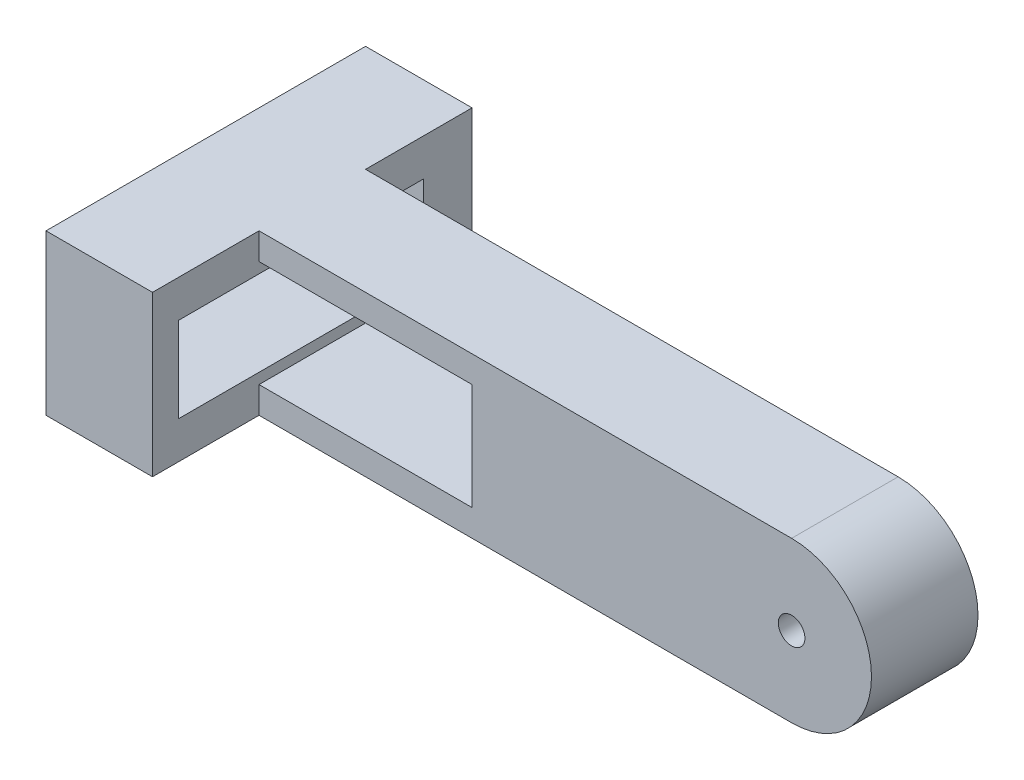
ISO-10303-21;
HEADER;
FILE_DESCRIPTION(('STEP AP214'),'2;1');
FILE_NAME('part.step','',(''),(''),'','','');
FILE_SCHEMA(('AUTOMOTIVE_DESIGN { 1 0 10303 214 1 1 1 1 }'));
ENDSEC;
DATA;
#1=APPLICATION_CONTEXT('core data for automotive mechanical design processes');
#2=APPLICATION_PROTOCOL_DEFINITION('international standard','automotive_design',2000,#1);
#3=PRODUCT_CONTEXT('',#1,'mechanical');
#4=PRODUCT('Part','Part','',(#3));
#5=PRODUCT_RELATED_PRODUCT_CATEGORY('part','',(#4));
#6=PRODUCT_DEFINITION_FORMATION('','',#4);
#7=PRODUCT_DEFINITION_CONTEXT('part definition',#1,'design');
#8=PRODUCT_DEFINITION('design','',#6,#7);
#9=PRODUCT_DEFINITION_SHAPE('','',#8);
#10=(LENGTH_UNIT() NAMED_UNIT(*) SI_UNIT(.MILLI.,.METRE.));
#11=(NAMED_UNIT(*) PLANE_ANGLE_UNIT() SI_UNIT($,.RADIAN.));
#12=(NAMED_UNIT(*) SI_UNIT($,.STERADIAN.) SOLID_ANGLE_UNIT());
#13=UNCERTAINTY_MEASURE_WITH_UNIT(LENGTH_MEASURE(1.E-05),#10,'distance_accuracy_value','');
#14=(GEOMETRIC_REPRESENTATION_CONTEXT(3) GLOBAL_UNCERTAINTY_ASSIGNED_CONTEXT((#13)) GLOBAL_UNIT_ASSIGNED_CONTEXT((#10,
#11,#12)) REPRESENTATION_CONTEXT('',''));
#15=CARTESIAN_POINT('',(0.,0.,0.));
#16=DIRECTION('',(0.,0.,1.));
#17=DIRECTION('',(1.,0.,0.));
#18=AXIS2_PLACEMENT_3D('',#15,#16,#17);
#19=CARTESIAN_POINT('',(-121.636901302796,-10.16,35.720147));
#20=DIRECTION('',(0.,0.,1.));
#21=DIRECTION('',(1.,0.,0.));
#22=AXIS2_PLACEMENT_3D('',#19,#20,#21);
#23=PLANE('',#22);
#24=DIRECTION('',(0.,-1.,0.));
#25=VECTOR('',#24,1.);
#26=CARTESIAN_POINT('',(-74.200004,-10.16,35.720147));
#27=LINE('',#26,#25);
#28=CARTESIAN_POINT('',(-74.200004,-1.27,35.720147));
#29=VERTEX_POINT('',#28);
#30=CARTESIAN_POINT('',(-74.200004,-10.16,35.720147));
#31=VERTEX_POINT('',#30);
#32=EDGE_CURVE('E263',#29,#31,#27,.T.);
#33=ORIENTED_EDGE('',*,*,#32,.F.);
#34=DIRECTION('',(1.,0.,0.));
#35=VECTOR('',#34,1.);
#36=CARTESIAN_POINT('',(-83.4457435593863,-1.27,35.720147));
#37=LINE('',#36,#35);
#38=CARTESIAN_POINT('',(-65.600072,-1.27,35.720147));
#39=VERTEX_POINT('',#38);
#40=EDGE_CURVE('E245',#29,#39,#37,.T.);
#41=ORIENTED_EDGE('',*,*,#40,.T.);
#42=DIRECTION('',(0.,1.,0.));
#43=VECTOR('',#42,1.);
#44=CARTESIAN_POINT('',(-65.600072,10.16,35.720147));
#45=LINE('',#44,#43);
#46=CARTESIAN_POINT('',(-65.600072,-10.16,35.720147));
#47=VERTEX_POINT('',#46);
#48=EDGE_CURVE('E487',#47,#39,#45,.T.);
#49=ORIENTED_EDGE('',*,*,#48,.F.);
#50=DIRECTION('',(1.,0.,0.));
#51=VECTOR('',#50,1.);
#52=CARTESIAN_POINT('',(-121.636901302796,-10.16,35.720147));
#53=LINE('',#52,#51);
#54=EDGE_CURVE('E271',#31,#47,#53,.T.);
#55=ORIENTED_EDGE('',*,*,#54,.F.);
#56=EDGE_LOOP('',(#33,#41,#49,#55));
#57=FACE_BOUND('',#56,.T.);
#58=ADVANCED_FACE('F58',(#57),#23,.F.);
#59=CARTESIAN_POINT('',(-121.636901302796,-10.16,-4.91985299999999));
#60=DIRECTION('',(0.,0.,-1.));
#61=DIRECTION('',(-1.,0.,0.));
#62=AXIS2_PLACEMENT_3D('',#59,#60,#61);
#63=PLANE('',#62);
#64=DIRECTION('',(0.,-1.,0.));
#65=VECTOR('',#64,1.);
#66=CARTESIAN_POINT('',(-65.600072,10.16,-4.91985299999999));
#67=LINE('',#66,#65);
#68=CARTESIAN_POINT('',(-65.600072,-1.27000000000001,-4.919853));
#69=VERTEX_POINT('',#68);
#70=CARTESIAN_POINT('',(-65.600072,-10.16,-4.91985299999999));
#71=VERTEX_POINT('',#70);
#72=EDGE_CURVE('E522',#69,#71,#67,.T.);
#73=ORIENTED_EDGE('',*,*,#72,.F.);
#74=DIRECTION('',(1.,0.,0.));
#75=VECTOR('',#74,1.);
#76=CARTESIAN_POINT('',(-83.4457435593863,-1.27000000000001,-4.919853));
#77=LINE('',#76,#75);
#78=CARTESIAN_POINT('',(-74.200004,-1.27000000000001,-4.919853));
#79=VERTEX_POINT('',#78);
#80=EDGE_CURVE('E589',#79,#69,#77,.T.);
#81=ORIENTED_EDGE('',*,*,#80,.F.);
#82=DIRECTION('',(0.,1.,0.));
#83=VECTOR('',#82,1.);
#84=CARTESIAN_POINT('',(-74.200004,-10.16,-4.91985299999999));
#85=LINE('',#84,#83);
#86=CARTESIAN_POINT('',(-74.200004,-10.16,-4.91985299999999));
#87=VERTEX_POINT('',#86);
#88=EDGE_CURVE('E291',#87,#79,#85,.T.);
#89=ORIENTED_EDGE('',*,*,#88,.F.);
#90=DIRECTION('',(1.,0.,0.));
#91=VECTOR('',#90,1.);
#92=CARTESIAN_POINT('',(-121.636901302796,-10.16,-4.91985299999999));
#93=LINE('',#92,#91);
#94=EDGE_CURVE('E283',#87,#71,#93,.T.);
#95=ORIENTED_EDGE('',*,*,#94,.T.);
#96=EDGE_LOOP('',(#73,#81,#89,#95));
#97=FACE_BOUND('',#96,.T.);
#98=ADVANCED_FACE('F456',(#97),#63,.F.);
#99=CARTESIAN_POINT('',(-65.600072,-19.0500000000001,25.4));
#100=DIRECTION('',(-1.,0.,0.));
#101=DIRECTION('',(0.,0.,1.));
#102=AXIS2_PLACEMENT_3D('',#99,#100,#101);
#103=PLANE('',#102);
#104=CARTESIAN_POINT('',(-65.600072,-4.99999,-9.099804));
#105=DIRECTION('',(-1.,0.,0.));
#106=DIRECTION('',(0.,0.,1.));
#107=AXIS2_PLACEMENT_3D('',#104,#105,#106);
#108=CIRCLE('',#107,1.90500000000001);
#109=CARTESIAN_POINT('',(-65.600072,-4.99999,-7.19480399999999));
#110=VERTEX_POINT('',#109);
#111=EDGE_CURVE('E490',#110,#110,#108,.F.);
#112=ORIENTED_EDGE('',*,*,#111,.F.);
#113=EDGE_LOOP('',(#112));
#114=FACE_BOUND('',#113,.T.);
#115=DIRECTION('',(0.,1.,0.));
#116=VECTOR('',#115,1.);
#117=CARTESIAN_POINT('',(-65.600072,10.16,-13.809853));
#118=LINE('',#117,#116);
#119=CARTESIAN_POINT('',(-65.600072,-10.16,-13.809853));
#120=VERTEX_POINT('',#119);
#121=CARTESIAN_POINT('',(-65.600072,-1.27000000000002,-13.809853));
#122=VERTEX_POINT('',#121);
#123=EDGE_CURVE('E510',#120,#122,#118,.T.);
#124=ORIENTED_EDGE('',*,*,#123,.T.);
#125=DIRECTION('',(0.,0.,-1.));
#126=VECTOR('',#125,1.);
#127=CARTESIAN_POINT('',(-65.600072,-1.27000000000001,-4.919853));
#128=LINE('',#127,#126);
#129=EDGE_CURVE('E75',#69,#122,#128,.T.);
#130=ORIENTED_EDGE('',*,*,#129,.F.);
#131=ORIENTED_EDGE('',*,*,#72,.T.);
#132=DIRECTION('',(0.,0.,-1.));
#133=VECTOR('',#132,1.);
#134=CARTESIAN_POINT('',(-65.600072,-10.16,-4.91985299999999));
#135=LINE('',#134,#133);
#136=EDGE_CURVE('E509',#71,#120,#135,.T.);
#137=ORIENTED_EDGE('',*,*,#136,.T.);
#138=EDGE_LOOP('',(#124,#130,#131,#137));
#139=FACE_BOUND('',#138,.T.);
#140=ADVANCED_FACE('F463',(#114,#139),#103,.F.);
#141=CARTESIAN_POINT('',(-65.600072,-19.0500000000001,25.4));
#142=DIRECTION('',(-1.,0.,0.));
#143=DIRECTION('',(0.,0.,1.));
#144=AXIS2_PLACEMENT_3D('',#141,#142,#143);
#145=PLANE('',#144);
#146=CARTESIAN_POINT('',(-65.600072,-4.99999,39.900098));
#147=DIRECTION('',(-1.,0.,0.));
#148=DIRECTION('',(0.,0.,1.));
#149=AXIS2_PLACEMENT_3D('',#146,#147,#148);
#150=CIRCLE('',#149,1.90500000000001);
#151=CARTESIAN_POINT('',(-65.600072,-4.99999,41.805098));
#152=VERTEX_POINT('',#151);
#153=EDGE_CURVE('E534',#152,#152,#150,.F.);
#154=ORIENTED_EDGE('',*,*,#153,.F.);
#155=EDGE_LOOP('',(#154));
#156=FACE_BOUND('',#155,.T.);
#157=ORIENTED_EDGE('',*,*,#48,.T.);
#158=DIRECTION('',(0.,0.,-1.));
#159=VECTOR('',#158,1.);
#160=CARTESIAN_POINT('',(-65.600072,-1.27,35.720147));
#161=LINE('',#160,#159);
#162=CARTESIAN_POINT('',(-65.600072,-1.27,44.610147));
#163=VERTEX_POINT('',#162);
#164=EDGE_CURVE('E251',#163,#39,#161,.T.);
#165=ORIENTED_EDGE('',*,*,#164,.F.);
#166=DIRECTION('',(0.,-1.,0.));
#167=VECTOR('',#166,1.);
#168=CARTESIAN_POINT('',(-65.600072,10.16,44.610147));
#169=LINE('',#168,#167);
#170=CARTESIAN_POINT('',(-65.600072,-10.16,44.610147));
#171=VERTEX_POINT('',#170);
#172=EDGE_CURVE('E500',#163,#171,#169,.T.);
#173=ORIENTED_EDGE('',*,*,#172,.T.);
#174=DIRECTION('',(0.,0.,-1.));
#175=VECTOR('',#174,1.);
#176=CARTESIAN_POINT('',(-65.600072,-10.16,35.720147));
#177=LINE('',#176,#175);
#178=EDGE_CURVE('E488',#171,#47,#177,.T.);
#179=ORIENTED_EDGE('',*,*,#178,.T.);
#180=EDGE_LOOP('',(#157,#165,#173,#179));
#181=FACE_BOUND('',#180,.T.);
#182=ADVANCED_FACE('F622',(#156,#181),#145,.F.);
#183=CARTESIAN_POINT('',(0.,0.,0.));
#184=DIRECTION('',(0.,0.,1.));
#185=DIRECTION('',(1.,0.,0.));
#186=AXIS2_PLACEMENT_3D('',#183,#184,#185);
#187=PLANE('',#186);
#188=CARTESIAN_POINT('',(76.2,0.,0.));
#189=DIRECTION('',(0.,0.,1.));
#190=DIRECTION('',(1.,0.,0.));
#191=AXIS2_PLACEMENT_3D('',#188,#189,#190);
#192=CIRCLE('',#191,3.175);
#193=CARTESIAN_POINT('',(79.375,0.,0.));
#194=VERTEX_POINT('',#193);
#195=EDGE_CURVE('E593',#194,#194,#192,.T.);
#196=ORIENTED_EDGE('',*,*,#195,.T.);
#197=EDGE_LOOP('',(#196));
#198=FACE_BOUND('',#197,.T.);
#199=DIRECTION('',(0.,-1.,0.));
#200=VECTOR('',#199,1.);
#201=CARTESIAN_POINT('',(0.,-12.7,0.));
#202=LINE('',#201,#200);
#203=CARTESIAN_POINT('',(0.,12.7,0.));
#204=VERTEX_POINT('',#203);
#205=CARTESIAN_POINT('',(0.,-12.7,0.));
#206=VERTEX_POINT('',#205);
#207=EDGE_CURVE('E292',#204,#206,#202,.T.);
#208=ORIENTED_EDGE('',*,*,#207,.F.);
#209=DIRECTION('',(1.,0.,0.));
#210=VECTOR('',#209,1.);
#211=CARTESIAN_POINT('',(0.,12.7,0.));
#212=LINE('',#211,#210);
#213=CARTESIAN_POINT('',(-50.8,12.7,0.));
#214=VERTEX_POINT('',#213);
#215=EDGE_CURVE('E294',#214,#204,#212,.T.);
#216=ORIENTED_EDGE('',*,*,#215,.F.);
#217=DIRECTION('',(0.,-1.,0.));
#218=VECTOR('',#217,1.);
#219=CARTESIAN_POINT('',(-50.8,19.05,0.));
#220=LINE('',#219,#218);
#221=CARTESIAN_POINT('',(-50.8,19.05,0.));
#222=VERTEX_POINT('',#221);
#223=EDGE_CURVE('E336',#222,#214,#220,.T.);
#224=ORIENTED_EDGE('',*,*,#223,.F.);
#225=DIRECTION('',(1.,0.,0.));
#226=VECTOR('',#225,1.);
#227=CARTESIAN_POINT('',(-76.2,19.05,0.));
#228=LINE('',#227,#226);
#229=CARTESIAN_POINT('',(76.2,19.05,0.));
#230=VERTEX_POINT('',#229);
#231=EDGE_CURVE('E379',#222,#230,#228,.T.);
#232=ORIENTED_EDGE('',*,*,#231,.T.);
#233=CARTESIAN_POINT('',(76.2,0.,0.));
#234=DIRECTION('',(0.,0.,1.));
#235=DIRECTION('',(1.,0.,0.));
#236=AXIS2_PLACEMENT_3D('',#233,#234,#235);
#237=CIRCLE('',#236,19.05);
#238=CARTESIAN_POINT('',(76.2,-19.05,0.));
#239=VERTEX_POINT('',#238);
#240=EDGE_CURVE('E372',#239,#230,#237,.T.);
#241=ORIENTED_EDGE('',*,*,#240,.F.);
#242=DIRECTION('',(1.,0.,0.));
#243=VECTOR('',#242,1.);
#244=CARTESIAN_POINT('',(-76.2,-19.0500000000001,0.));
#245=LINE('',#244,#243);
#246=CARTESIAN_POINT('',(-50.8,-19.0500000000001,0.));
#247=VERTEX_POINT('',#246);
#248=EDGE_CURVE('E376',#247,#239,#245,.T.);
#249=ORIENTED_EDGE('',*,*,#248,.F.);
#250=CARTESIAN_POINT('',(-50.8,-12.7,0.));
#251=VERTEX_POINT('',#250);
#252=EDGE_CURVE('E331',#251,#247,#220,.T.);
#253=ORIENTED_EDGE('',*,*,#252,.F.);
#254=DIRECTION('',(-1.,0.,0.));
#255=VECTOR('',#254,1.);
#256=CARTESIAN_POINT('',(0.,-12.7,0.));
#257=LINE('',#256,#255);
#258=EDGE_CURVE('E297',#206,#251,#257,.T.);
#259=ORIENTED_EDGE('',*,*,#258,.F.);
#260=EDGE_LOOP('',(#208,#216,#224,#232,#241,#249,#253,#259));
#261=FACE_BOUND('',#260,.T.);
#262=ADVANCED_FACE('F399',(#198,#261),#187,.F.);
#263=CARTESIAN_POINT('',(-76.2,19.05,25.4));
#264=DIRECTION('',(0.,1.,0.));
#265=DIRECTION('',(-1.,0.,0.));
#266=AXIS2_PLACEMENT_3D('',#263,#264,#265);
#267=PLANE('',#266);
#268=ORIENTED_EDGE('',*,*,#231,.F.);
#269=DIRECTION('',(0.,0.,1.));
#270=VECTOR('',#269,1.);
#271=CARTESIAN_POINT('',(-50.8,19.05,-25.4));
#272=LINE('',#271,#270);
#273=CARTESIAN_POINT('',(-50.8,19.05,-25.4));
#274=VERTEX_POINT('',#273);
#275=EDGE_CURVE('E349',#274,#222,#272,.T.);
#276=ORIENTED_EDGE('',*,*,#275,.F.);
#277=DIRECTION('',(1.,0.,0.));
#278=VECTOR('',#277,1.);
#279=CARTESIAN_POINT('',(-76.2,19.05,-25.4));
#280=LINE('',#279,#278);
#281=CARTESIAN_POINT('',(-76.2,19.05,-25.4));
#282=VERTEX_POINT('',#281);
#283=EDGE_CURVE('E332',#282,#274,#280,.T.);
#284=ORIENTED_EDGE('',*,*,#283,.F.);
#285=DIRECTION('',(0.,0.,-1.));
#286=VECTOR('',#285,1.);
#287=CARTESIAN_POINT('',(-76.2,19.05,25.4));
#288=LINE('',#287,#286);
#289=CARTESIAN_POINT('',(-76.2,19.05,50.8));
#290=VERTEX_POINT('',#289);
#291=EDGE_CURVE('E13',#290,#282,#288,.T.);
#292=ORIENTED_EDGE('',*,*,#291,.F.);
#293=DIRECTION('',(-1.,0.,0.));
#294=VECTOR('',#293,1.);
#295=CARTESIAN_POINT('',(-76.2,19.05,50.8));
#296=LINE('',#295,#294);
#297=CARTESIAN_POINT('',(-50.8,19.05,50.8));
#298=VERTEX_POINT('',#297);
#299=EDGE_CURVE('E361',#298,#290,#296,.T.);
#300=ORIENTED_EDGE('',*,*,#299,.F.);
#301=DIRECTION('',(0.,0.,-1.));
#302=VECTOR('',#301,1.);
#303=CARTESIAN_POINT('',(-50.8,19.05,50.8));
#304=LINE('',#303,#302);
#305=CARTESIAN_POINT('',(-50.8,19.05,25.4));
#306=VERTEX_POINT('',#305);
#307=EDGE_CURVE('E364',#298,#306,#304,.T.);
#308=ORIENTED_EDGE('',*,*,#307,.T.);
#309=DIRECTION('',(1.,0.,0.));
#310=VECTOR('',#309,1.);
#311=CARTESIAN_POINT('',(-76.2,19.05,25.4));
#312=LINE('',#311,#310);
#313=CARTESIAN_POINT('',(76.2,19.05,25.4));
#314=VERTEX_POINT('',#313);
#315=EDGE_CURVE('E373',#306,#314,#312,.T.);
#316=ORIENTED_EDGE('',*,*,#315,.T.);
#317=DIRECTION('',(0.,0.,-1.));
#318=VECTOR('',#317,1.);
#319=CARTESIAN_POINT('',(76.2,19.05,25.4));
#320=LINE('',#319,#318);
#321=EDGE_CURVE('E378',#314,#230,#320,.T.);
#322=ORIENTED_EDGE('',*,*,#321,.T.);
#323=EDGE_LOOP('',(#268,#276,#284,#292,#300,#308,#316,#322));
#324=FACE_BOUND('',#323,.T.);
#325=ADVANCED_FACE('F405',(#324),#267,.T.);
#326=CARTESIAN_POINT('',(-76.2,-19.0500000000001,25.4));
#327=DIRECTION('',(-1.,0.,0.));
#328=DIRECTION('',(0.,0.,1.));
#329=AXIS2_PLACEMENT_3D('',#326,#327,#328);
#330=PLANE('',#329);
#331=CARTESIAN_POINT('',(-76.2,-4.99999,39.900098));
#332=DIRECTION('',(-1.,0.,0.));
#333=DIRECTION('',(0.,0.,-1.));
#334=AXIS2_PLACEMENT_3D('',#331,#332,#333);
#335=CIRCLE('',#334,1.90500000000001);
#336=CARTESIAN_POINT('',(-76.2,-4.99999,37.995098));
#337=VERTEX_POINT('',#336);
#338=EDGE_CURVE('E316',#337,#337,#335,.T.);
#339=ORIENTED_EDGE('',*,*,#338,.F.);
#340=EDGE_LOOP('',(#339));
#341=FACE_BOUND('',#340,.T.);
#342=CARTESIAN_POINT('',(-76.2,-4.99999,-9.099804));
#343=DIRECTION('',(-1.,0.,0.));
#344=DIRECTION('',(0.,0.,-1.));
#345=AXIS2_PLACEMENT_3D('',#342,#343,#344);
#346=CIRCLE('',#345,1.90500000000001);
#347=CARTESIAN_POINT('',(-76.2,-4.99999,-11.004804));
#348=VERTEX_POINT('',#347);
#349=EDGE_CURVE('E324',#348,#348,#346,.T.);
#350=ORIENTED_EDGE('',*,*,#349,.F.);
#351=EDGE_LOOP('',(#350));
#352=FACE_BOUND('',#351,.T.);
#353=CARTESIAN_POINT('',(-76.2,4.99999,-9.099804));
#354=DIRECTION('',(-1.,0.,0.));
#355=DIRECTION('',(0.,0.,1.));
#356=AXIS2_PLACEMENT_3D('',#353,#354,#355);
#357=CIRCLE('',#356,1.90500000000001);
#358=CARTESIAN_POINT('',(-76.2,4.99999,-7.19480399999999));
#359=VERTEX_POINT('',#358);
#360=EDGE_CURVE('E321',#359,#359,#357,.T.);
#361=ORIENTED_EDGE('',*,*,#360,.F.);
#362=EDGE_LOOP('',(#361));
#363=FACE_BOUND('',#362,.T.);
#364=CARTESIAN_POINT('',(-76.2,4.99999,39.900098));
#365=DIRECTION('',(-1.,0.,0.));
#366=DIRECTION('',(0.,0.,1.));
#367=AXIS2_PLACEMENT_3D('',#364,#365,#366);
#368=CIRCLE('',#367,1.90500000000001);
#369=CARTESIAN_POINT('',(-76.2,4.99999,41.805098));
#370=VERTEX_POINT('',#369);
#371=EDGE_CURVE('E317',#370,#370,#368,.T.);
#372=ORIENTED_EDGE('',*,*,#371,.F.);
#373=EDGE_LOOP('',(#372));
#374=FACE_BOUND('',#373,.T.);
#375=CARTESIAN_POINT('',(-76.2,0.,25.4));
#376=DIRECTION('',(-1.,0.,0.));
#377=DIRECTION('',(0.,0.,1.));
#378=AXIS2_PLACEMENT_3D('',#375,#376,#377);
#379=CIRCLE('',#378,6.98499999999999);
#380=CARTESIAN_POINT('',(-76.2,0.,32.385));
#381=VERTEX_POINT('',#380);
#382=EDGE_CURVE('E320',#381,#381,#379,.T.);
#383=ORIENTED_EDGE('',*,*,#382,.F.);
#384=EDGE_LOOP('',(#383));
#385=FACE_BOUND('',#384,.T.);
#386=ORIENTED_EDGE('',*,*,#291,.T.);
#387=DIRECTION('',(0.,1.,0.));
#388=VECTOR('',#387,1.);
#389=CARTESIAN_POINT('',(-76.2,-19.0500000000001,-25.4));
#390=LINE('',#389,#388);
#391=CARTESIAN_POINT('',(-76.2,-19.0500000000001,-25.4));
#392=VERTEX_POINT('',#391);
#393=EDGE_CURVE('E341',#392,#282,#390,.T.);
#394=ORIENTED_EDGE('',*,*,#393,.F.);
#395=DIRECTION('',(0.,0.,-1.));
#396=VECTOR('',#395,1.);
#397=CARTESIAN_POINT('',(-76.2,-19.0500000000001,25.4));
#398=LINE('',#397,#396);
#399=CARTESIAN_POINT('',(-76.2,-19.0500000000001,50.8));
#400=VERTEX_POINT('',#399);
#401=EDGE_CURVE('E67',#400,#392,#398,.T.);
#402=ORIENTED_EDGE('',*,*,#401,.F.);
#403=DIRECTION('',(0.,-1.,0.));
#404=VECTOR('',#403,1.);
#405=CARTESIAN_POINT('',(-76.2,19.05,50.8));
#406=LINE('',#405,#404);
#407=EDGE_CURVE('E353',#290,#400,#406,.T.);
#408=ORIENTED_EDGE('',*,*,#407,.F.);
#409=EDGE_LOOP('',(#386,#394,#402,#408));
#410=FACE_BOUND('',#409,.T.);
#411=ADVANCED_FACE('F437',(#341,#352,#363,#374,#385,#410),#330,.T.);
#412=CARTESIAN_POINT('',(-76.2,-19.0500000000001,25.4));
#413=DIRECTION('',(0.,1.,0.));
#414=DIRECTION('',(-1.,0.,0.));
#415=AXIS2_PLACEMENT_3D('',#412,#413,#414);
#416=PLANE('',#415);
#417=ORIENTED_EDGE('',*,*,#401,.T.);
#418=DIRECTION('',(-1.,0.,0.));
#419=VECTOR('',#418,1.);
#420=CARTESIAN_POINT('',(-50.8,-19.0500000000001,-25.4));
#421=LINE('',#420,#419);
#422=CARTESIAN_POINT('',(-50.8,-19.0500000000001,-25.4));
#423=VERTEX_POINT('',#422);
#424=EDGE_CURVE('E338',#423,#392,#421,.T.);
#425=ORIENTED_EDGE('',*,*,#424,.F.);
#426=DIRECTION('',(0.,0.,1.));
#427=VECTOR('',#426,1.);
#428=CARTESIAN_POINT('',(-50.8,-19.0500000000001,-25.4));
#429=LINE('',#428,#427);
#430=EDGE_CURVE('E344',#423,#247,#429,.T.);
#431=ORIENTED_EDGE('',*,*,#430,.T.);
#432=ORIENTED_EDGE('',*,*,#248,.T.);
#433=DIRECTION('',(0.,0.,-1.));
#434=VECTOR('',#433,1.);
#435=CARTESIAN_POINT('',(76.2,-19.05,25.4));
#436=LINE('',#435,#434);
#437=CARTESIAN_POINT('',(76.2,-19.05,25.4));
#438=VERTEX_POINT('',#437);
#439=EDGE_CURVE('E384',#438,#239,#436,.T.);
#440=ORIENTED_EDGE('',*,*,#439,.F.);
#441=DIRECTION('',(1.,0.,0.));
#442=VECTOR('',#441,1.);
#443=CARTESIAN_POINT('',(-76.2,-19.0500000000001,25.4));
#444=LINE('',#443,#442);
#445=CARTESIAN_POINT('',(-50.8,-19.0500000000001,25.4));
#446=VERTEX_POINT('',#445);
#447=EDGE_CURVE('E375',#446,#438,#444,.T.);
#448=ORIENTED_EDGE('',*,*,#447,.F.);
#449=DIRECTION('',(0.,0.,-1.));
#450=VECTOR('',#449,1.);
#451=CARTESIAN_POINT('',(-50.8,-19.0500000000001,50.8));
#452=LINE('',#451,#450);
#453=CARTESIAN_POINT('',(-50.8,-19.0500000000001,50.8));
#454=VERTEX_POINT('',#453);
#455=EDGE_CURVE('E369',#454,#446,#452,.T.);
#456=ORIENTED_EDGE('',*,*,#455,.F.);
#457=DIRECTION('',(1.,0.,0.));
#458=VECTOR('',#457,1.);
#459=CARTESIAN_POINT('',(-76.2,-19.0500000000001,50.8));
#460=LINE('',#459,#458);
#461=EDGE_CURVE('E356',#400,#454,#460,.T.);
#462=ORIENTED_EDGE('',*,*,#461,.F.);
#463=EDGE_LOOP('',(#417,#425,#431,#432,#440,#448,#456,#462));
#464=FACE_BOUND('',#463,.T.);
#465=ADVANCED_FACE('F417',(#464),#416,.F.);
#466=CARTESIAN_POINT('',(0.,0.,25.4));
#467=DIRECTION('',(0.,0.,1.));
#468=DIRECTION('',(1.,0.,0.));
#469=AXIS2_PLACEMENT_3D('',#466,#467,#468);
#470=PLANE('',#469);
#471=CARTESIAN_POINT('',(76.2,0.,25.4));
#472=DIRECTION('',(0.,0.,1.));
#473=DIRECTION('',(1.,0.,0.));
#474=AXIS2_PLACEMENT_3D('',#471,#472,#473);
#475=CIRCLE('',#474,3.175);
#476=CARTESIAN_POINT('',(79.375,0.,25.4));
#477=VERTEX_POINT('',#476);
#478=EDGE_CURVE('E605',#477,#477,#475,.T.);
#479=ORIENTED_EDGE('',*,*,#478,.F.);
#480=EDGE_LOOP('',(#479));
#481=FACE_BOUND('',#480,.T.);
#482=DIRECTION('',(-1.,0.,0.));
#483=VECTOR('',#482,1.);
#484=CARTESIAN_POINT('',(0.,12.7,25.4));
#485=LINE('',#484,#483);
#486=CARTESIAN_POINT('',(0.,12.7,25.4));
#487=VERTEX_POINT('',#486);
#488=CARTESIAN_POINT('',(-50.8,12.7,25.4));
#489=VERTEX_POINT('',#488);
#490=EDGE_CURVE('E304',#487,#489,#485,.T.);
#491=ORIENTED_EDGE('',*,*,#490,.F.);
#492=DIRECTION('',(0.,1.,0.));
#493=VECTOR('',#492,1.);
#494=CARTESIAN_POINT('',(0.,-12.7,25.4));
#495=LINE('',#494,#493);
#496=CARTESIAN_POINT('',(0.,-12.7,25.4));
#497=VERTEX_POINT('',#496);
#498=EDGE_CURVE('E301',#497,#487,#495,.T.);
#499=ORIENTED_EDGE('',*,*,#498,.F.);
#500=DIRECTION('',(1.,0.,0.));
#501=VECTOR('',#500,1.);
#502=CARTESIAN_POINT('',(0.,-12.7,25.4));
#503=LINE('',#502,#501);
#504=CARTESIAN_POINT('',(-50.8,-12.7,25.4));
#505=VERTEX_POINT('',#504);
#506=EDGE_CURVE('E298',#505,#497,#503,.T.);
#507=ORIENTED_EDGE('',*,*,#506,.F.);
#508=DIRECTION('',(0.,1.,0.));
#509=VECTOR('',#508,1.);
#510=CARTESIAN_POINT('',(-50.8,19.05,25.4));
#511=LINE('',#510,#509);
#512=EDGE_CURVE('E357',#446,#505,#511,.T.);
#513=ORIENTED_EDGE('',*,*,#512,.F.);
#514=ORIENTED_EDGE('',*,*,#447,.T.);
#515=CARTESIAN_POINT('',(76.2,0.,25.4));
#516=DIRECTION('',(0.,0.,1.));
#517=DIRECTION('',(1.,0.,0.));
#518=AXIS2_PLACEMENT_3D('',#515,#516,#517);
#519=CIRCLE('',#518,19.05);
#520=EDGE_CURVE('E381',#438,#314,#519,.T.);
#521=ORIENTED_EDGE('',*,*,#520,.T.);
#522=ORIENTED_EDGE('',*,*,#315,.F.);
#523=EDGE_CURVE('E352',#489,#306,#511,.T.);
#524=ORIENTED_EDGE('',*,*,#523,.F.);
#525=EDGE_LOOP('',(#491,#499,#507,#513,#514,#521,#522,#524));
#526=FACE_BOUND('',#525,.T.);
#527=ADVANCED_FACE('F412',(#481,#526),#470,.T.);
#528=CARTESIAN_POINT('',(76.2,0.,25.4));
#529=DIRECTION('',(0.,0.,-1.));
#530=DIRECTION('',(-1.,0.,0.));
#531=AXIS2_PLACEMENT_3D('',#528,#529,#530);
#532=CYLINDRICAL_SURFACE('',#531,19.05);
#533=ORIENTED_EDGE('',*,*,#240,.T.);
#534=ORIENTED_EDGE('',*,*,#321,.F.);
#535=ORIENTED_EDGE('',*,*,#520,.F.);
#536=ORIENTED_EDGE('',*,*,#439,.T.);
#537=EDGE_LOOP('',(#533,#534,#535,#536));
#538=FACE_BOUND('',#537,.T.);
#539=ADVANCED_FACE('F60',(#538),#532,.T.);
#540=CARTESIAN_POINT('',(-50.8,19.05,50.8));
#541=DIRECTION('',(-1.,0.,0.));
#542=DIRECTION('',(0.,-1.,0.));
#543=AXIS2_PLACEMENT_3D('',#540,#541,#542);
#544=PLANE('',#543);
#545=DIRECTION('',(0.,-1.,0.));
#546=VECTOR('',#545,1.);
#547=CARTESIAN_POINT('',(-50.8,10.16,44.610147));
#548=LINE('',#547,#546);
#549=CARTESIAN_POINT('',(-50.8,10.16,44.610147));
#550=VERTEX_POINT('',#549);
#551=CARTESIAN_POINT('',(-50.8,-10.16,44.610147));
#552=VERTEX_POINT('',#551);
#553=EDGE_CURVE('E528',#550,#552,#548,.T.);
#554=ORIENTED_EDGE('',*,*,#553,.F.);
#555=DIRECTION('',(0.,0.,1.));
#556=VECTOR('',#555,1.);
#557=CARTESIAN_POINT('',(-50.8,10.16,35.720147));
#558=LINE('',#557,#556);
#559=CARTESIAN_POINT('',(-50.8,10.16,-13.809853));
#560=VERTEX_POINT('',#559);
#561=EDGE_CURVE('E540',#560,#550,#558,.T.);
#562=ORIENTED_EDGE('',*,*,#561,.F.);
#563=DIRECTION('',(0.,1.,0.));
#564=VECTOR('',#563,1.);
#565=CARTESIAN_POINT('',(-50.8,10.16,-13.809853));
#566=LINE('',#565,#564);
#567=CARTESIAN_POINT('',(-50.8,-10.16,-13.809853));
#568=VERTEX_POINT('',#567);
#569=EDGE_CURVE('E525',#568,#560,#566,.T.);
#570=ORIENTED_EDGE('',*,*,#569,.F.);
#571=DIRECTION('',(0.,0.,-1.));
#572=VECTOR('',#571,1.);
#573=CARTESIAN_POINT('',(-50.8,-10.16,35.720147));
#574=LINE('',#573,#572);
#575=EDGE_CURVE('E541',#552,#568,#574,.T.);
#576=ORIENTED_EDGE('',*,*,#575,.F.);
#577=EDGE_LOOP('',(#554,#562,#570,#576));
#578=FACE_BOUND('',#577,.T.);
#579=ORIENTED_EDGE('',*,*,#512,.T.);
#580=DIRECTION('',(0.,0.,1.));
#581=VECTOR('',#580,1.);
#582=CARTESIAN_POINT('',(-50.8,-12.7,-56.7961266284947));
#583=LINE('',#582,#581);
#584=EDGE_CURVE('E307',#251,#505,#583,.T.);
#585=ORIENTED_EDGE('',*,*,#584,.F.);
#586=ORIENTED_EDGE('',*,*,#252,.T.);
#587=ORIENTED_EDGE('',*,*,#430,.F.);
#588=DIRECTION('',(0.,-1.,0.));
#589=VECTOR('',#588,1.);
#590=CARTESIAN_POINT('',(-50.8,19.05,-25.4));
#591=LINE('',#590,#589);
#592=EDGE_CURVE('E335',#274,#423,#591,.T.);
#593=ORIENTED_EDGE('',*,*,#592,.F.);
#594=ORIENTED_EDGE('',*,*,#275,.T.);
#595=ORIENTED_EDGE('',*,*,#223,.T.);
#596=DIRECTION('',(0.,0.,1.));
#597=VECTOR('',#596,1.);
#598=CARTESIAN_POINT('',(-50.8,12.7,-56.7961266284947));
#599=LINE('',#598,#597);
#600=EDGE_CURVE('E295',#214,#489,#599,.T.);
#601=ORIENTED_EDGE('',*,*,#600,.T.);
#602=ORIENTED_EDGE('',*,*,#523,.T.);
#603=ORIENTED_EDGE('',*,*,#307,.F.);
#604=DIRECTION('',(0.,1.,0.));
#605=VECTOR('',#604,1.);
#606=CARTESIAN_POINT('',(-50.8,19.05,50.8));
#607=LINE('',#606,#605);
#608=EDGE_CURVE('E359',#454,#298,#607,.T.);
#609=ORIENTED_EDGE('',*,*,#608,.F.);
#610=ORIENTED_EDGE('',*,*,#455,.T.);
#611=EDGE_LOOP('',(#579,#585,#586,#587,#593,#594,#595,#601,#602,#603,#609,#610));
#612=FACE_BOUND('',#611,.T.);
#613=ADVANCED_FACE('F421',(#578,#612),#544,.F.);
#614=CARTESIAN_POINT('',(0.,0.,50.8));
#615=DIRECTION('',(0.,0.,1.));
#616=DIRECTION('',(1.,0.,0.));
#617=AXIS2_PLACEMENT_3D('',#614,#615,#616);
#618=PLANE('',#617);
#619=ORIENTED_EDGE('',*,*,#407,.T.);
#620=ORIENTED_EDGE('',*,*,#461,.T.);
#621=ORIENTED_EDGE('',*,*,#608,.T.);
#622=ORIENTED_EDGE('',*,*,#299,.T.);
#623=EDGE_LOOP('',(#619,#620,#621,#622));
#624=FACE_BOUND('',#623,.T.);
#625=ADVANCED_FACE('F441',(#624),#618,.T.);
#626=CARTESIAN_POINT('',(0.,0.,-25.4));
#627=DIRECTION('',(0.,0.,-1.));
#628=DIRECTION('',(-1.,0.,0.));
#629=AXIS2_PLACEMENT_3D('',#626,#627,#628);
#630=PLANE('',#629);
#631=ORIENTED_EDGE('',*,*,#283,.T.);
#632=ORIENTED_EDGE('',*,*,#592,.T.);
#633=ORIENTED_EDGE('',*,*,#424,.T.);
#634=ORIENTED_EDGE('',*,*,#393,.T.);
#635=EDGE_LOOP('',(#631,#632,#633,#634));
#636=FACE_BOUND('',#635,.T.);
#637=ADVANCED_FACE('F434',(#636),#630,.T.);
#638=CARTESIAN_POINT('',(-31.0434365336479,4.99999,-9.099804));
#639=DIRECTION('',(-1.,0.,0.));
#640=DIRECTION('',(0.,0.,1.));
#641=AXIS2_PLACEMENT_3D('',#638,#639,#640);
#642=CYLINDRICAL_SURFACE('',#641,1.90500000000001);
#643=CARTESIAN_POINT('',(-65.600072,4.99999,-9.099804));
#644=DIRECTION('',(-1.,0.,0.));
#645=DIRECTION('',(0.,0.,1.));
#646=AXIS2_PLACEMENT_3D('',#643,#644,#645);
#647=CIRCLE('',#646,1.90500000000001);
#648=CARTESIAN_POINT('',(-65.600072,4.99999,-7.19480399999999));
#649=VERTEX_POINT('',#648);
#650=EDGE_CURVE('E531',#649,#649,#647,.F.);
#651=ORIENTED_EDGE('',*,*,#650,.T.);
#652=EDGE_LOOP('',(#651));
#653=FACE_BOUND('',#652,.T.);
#654=ORIENTED_EDGE('',*,*,#360,.T.);
#655=EDGE_LOOP('',(#654));
#656=FACE_BOUND('',#655,.T.);
#657=ADVANCED_FACE('F450',(#653,#656),#642,.F.);
#658=CARTESIAN_POINT('',(-31.0434365336479,-4.99999,-9.099804));
#659=DIRECTION('',(-1.,0.,0.));
#660=DIRECTION('',(0.,0.,1.));
#661=AXIS2_PLACEMENT_3D('',#658,#659,#660);
#662=CYLINDRICAL_SURFACE('',#661,1.90500000000001);
#663=ORIENTED_EDGE('',*,*,#111,.T.);
#664=EDGE_LOOP('',(#663));
#665=FACE_BOUND('',#664,.T.);
#666=ORIENTED_EDGE('',*,*,#349,.T.);
#667=EDGE_LOOP('',(#666));
#668=FACE_BOUND('',#667,.T.);
#669=ADVANCED_FACE('F677',(#665,#668),#662,.F.);
#670=CARTESIAN_POINT('',(-31.0434365336479,0.,25.4));
#671=DIRECTION('',(-1.,0.,0.));
#672=DIRECTION('',(0.,0.,1.));
#673=AXIS2_PLACEMENT_3D('',#670,#671,#672);
#674=CYLINDRICAL_SURFACE('',#673,6.98499999999999);
#675=CARTESIAN_POINT('',(-74.200004,0.,25.4));
#676=DIRECTION('',(-1.,0.,0.));
#677=DIRECTION('',(0.,0.,1.));
#678=AXIS2_PLACEMENT_3D('',#675,#676,#677);
#679=CIRCLE('',#678,6.98499999999999);
#680=CARTESIAN_POINT('',(-74.200004,0.,32.385));
#681=VERTEX_POINT('',#680);
#682=EDGE_CURVE('E62',#681,#681,#679,.F.);
#683=ORIENTED_EDGE('',*,*,#682,.T.);
#684=EDGE_LOOP('',(#683));
#685=FACE_BOUND('',#684,.T.);
#686=ORIENTED_EDGE('',*,*,#382,.T.);
#687=EDGE_LOOP('',(#686));
#688=FACE_BOUND('',#687,.T.);
#689=ADVANCED_FACE('F673',(#685,#688),#674,.F.);
#690=CARTESIAN_POINT('',(-31.0434365336479,4.99999,39.900098));
#691=DIRECTION('',(-1.,0.,0.));
#692=DIRECTION('',(0.,0.,1.));
#693=AXIS2_PLACEMENT_3D('',#690,#691,#692);
#694=CYLINDRICAL_SURFACE('',#693,1.90500000000001);
#695=CARTESIAN_POINT('',(-65.600072,4.99999,39.900098));
#696=DIRECTION('',(-1.,0.,0.));
#697=DIRECTION('',(0.,0.,1.));
#698=AXIS2_PLACEMENT_3D('',#695,#696,#697);
#699=CIRCLE('',#698,1.90500000000001);
#700=CARTESIAN_POINT('',(-65.600072,4.99999,41.805098));
#701=VERTEX_POINT('',#700);
#702=EDGE_CURVE('E537',#701,#701,#699,.F.);
#703=ORIENTED_EDGE('',*,*,#702,.T.);
#704=EDGE_LOOP('',(#703));
#705=FACE_BOUND('',#704,.T.);
#706=ORIENTED_EDGE('',*,*,#371,.T.);
#707=EDGE_LOOP('',(#706));
#708=FACE_BOUND('',#707,.T.);
#709=ADVANCED_FACE('F676',(#705,#708),#694,.F.);
#710=CARTESIAN_POINT('',(-31.0434365336479,-4.99999,39.900098));
#711=DIRECTION('',(-1.,0.,0.));
#712=DIRECTION('',(0.,0.,1.));
#713=AXIS2_PLACEMENT_3D('',#710,#711,#712);
#714=CYLINDRICAL_SURFACE('',#713,1.90500000000001);
#715=ORIENTED_EDGE('',*,*,#153,.T.);
#716=EDGE_LOOP('',(#715));
#717=FACE_BOUND('',#716,.T.);
#718=ORIENTED_EDGE('',*,*,#338,.T.);
#719=EDGE_LOOP('',(#718));
#720=FACE_BOUND('',#719,.T.);
#721=ADVANCED_FACE('F652',(#717,#720),#714,.F.);
#722=CARTESIAN_POINT('',(0.,12.7,-56.7961266284947));
#723=DIRECTION('',(0.,1.,0.));
#724=DIRECTION('',(-1.,0.,0.));
#725=AXIS2_PLACEMENT_3D('',#722,#723,#724);
#726=PLANE('',#725);
#727=ORIENTED_EDGE('',*,*,#215,.T.);
#728=DIRECTION('',(0.,0.,1.));
#729=VECTOR('',#728,1.);
#730=CARTESIAN_POINT('',(0.,12.7,-56.7961266284947));
#731=LINE('',#730,#729);
#732=EDGE_CURVE('E309',#204,#487,#731,.T.);
#733=ORIENTED_EDGE('',*,*,#732,.T.);
#734=ORIENTED_EDGE('',*,*,#490,.T.);
#735=ORIENTED_EDGE('',*,*,#600,.F.);
#736=EDGE_LOOP('',(#727,#733,#734,#735));
#737=FACE_BOUND('',#736,.T.);
#738=ADVANCED_FACE('F431',(#737),#726,.F.);
#739=CARTESIAN_POINT('',(0.,-12.7,-56.7961266284947));
#740=DIRECTION('',(1.,0.,0.));
#741=DIRECTION('',(0.,0.,-1.));
#742=AXIS2_PLACEMENT_3D('',#739,#740,#741);
#743=PLANE('',#742);
#744=ORIENTED_EDGE('',*,*,#207,.T.);
#745=DIRECTION('',(0.,0.,1.));
#746=VECTOR('',#745,1.);
#747=CARTESIAN_POINT('',(0.,-12.7,-56.7961266284947));
#748=LINE('',#747,#746);
#749=EDGE_CURVE('E311',#206,#497,#748,.T.);
#750=ORIENTED_EDGE('',*,*,#749,.T.);
#751=ORIENTED_EDGE('',*,*,#498,.T.);
#752=ORIENTED_EDGE('',*,*,#732,.F.);
#753=EDGE_LOOP('',(#744,#750,#751,#752));
#754=FACE_BOUND('',#753,.T.);
#755=ADVANCED_FACE('F428',(#754),#743,.F.);
#756=CARTESIAN_POINT('',(0.,-12.7,-56.7961266284947));
#757=DIRECTION('',(0.,-1.,0.));
#758=DIRECTION('',(1.,0.,0.));
#759=AXIS2_PLACEMENT_3D('',#756,#757,#758);
#760=PLANE('',#759);
#761=ORIENTED_EDGE('',*,*,#258,.T.);
#762=ORIENTED_EDGE('',*,*,#584,.T.);
#763=ORIENTED_EDGE('',*,*,#506,.T.);
#764=ORIENTED_EDGE('',*,*,#749,.F.);
#765=EDGE_LOOP('',(#761,#762,#763,#764));
#766=FACE_BOUND('',#765,.T.);
#767=ADVANCED_FACE('F425',(#766),#760,.F.);
#768=CARTESIAN_POINT('',(-74.200004,-19.0500000000001,25.4));
#769=DIRECTION('',(-1.,0.,0.));
#770=DIRECTION('',(0.,0.,1.));
#771=AXIS2_PLACEMENT_3D('',#768,#769,#770);
#772=PLANE('',#771);
#773=ORIENTED_EDGE('',*,*,#88,.T.);
#774=DIRECTION('',(0.,0.,-1.));
#775=VECTOR('',#774,1.);
#776=CARTESIAN_POINT('',(-74.200004,-1.27000000000001,-4.919853));
#777=LINE('',#776,#775);
#778=CARTESIAN_POINT('',(-74.200004,-1.27000000000002,-13.809853));
#779=VERTEX_POINT('',#778);
#780=EDGE_CURVE('E580',#79,#779,#777,.T.);
#781=ORIENTED_EDGE('',*,*,#780,.T.);
#782=DIRECTION('',(0.,1.,0.));
#783=VECTOR('',#782,1.);
#784=CARTESIAN_POINT('',(-74.200004,-1.27000000000002,-13.809853));
#785=LINE('',#784,#783);
#786=CARTESIAN_POINT('',(-74.200004,1.26999999999998,-13.809853));
#787=VERTEX_POINT('',#786);
#788=EDGE_CURVE('E586',#779,#787,#785,.T.);
#789=ORIENTED_EDGE('',*,*,#788,.T.);
#790=DIRECTION('',(0.,0.,1.));
#791=VECTOR('',#790,1.);
#792=CARTESIAN_POINT('',(-74.200004,1.26999999999999,-4.919853));
#793=LINE('',#792,#791);
#794=CARTESIAN_POINT('',(-74.200004,1.26999999999999,-4.919853));
#795=VERTEX_POINT('',#794);
#796=EDGE_CURVE('E550',#787,#795,#793,.T.);
#797=ORIENTED_EDGE('',*,*,#796,.T.);
#798=CARTESIAN_POINT('',(-74.200004,10.16,-4.91985299999999));
#799=VERTEX_POINT('',#798);
#800=EDGE_CURVE('E286',#795,#799,#85,.T.);
#801=ORIENTED_EDGE('',*,*,#800,.T.);
#802=DIRECTION('',(0.,0.,1.));
#803=VECTOR('',#802,1.);
#804=CARTESIAN_POINT('',(-74.200004,10.16,35.720147));
#805=LINE('',#804,#803);
#806=CARTESIAN_POINT('',(-74.200004,10.16,35.720147));
#807=VERTEX_POINT('',#806);
#808=EDGE_CURVE('E277',#799,#807,#805,.T.);
#809=ORIENTED_EDGE('',*,*,#808,.T.);
#810=CARTESIAN_POINT('',(-74.200004,1.27,35.720147));
#811=VERTEX_POINT('',#810);
#812=EDGE_CURVE('E272',#807,#811,#27,.T.);
#813=ORIENTED_EDGE('',*,*,#812,.T.);
#814=DIRECTION('',(0.,0.,1.));
#815=VECTOR('',#814,1.);
#816=CARTESIAN_POINT('',(-74.200004,1.27,35.720147));
#817=LINE('',#816,#815);
#818=CARTESIAN_POINT('',(-74.200004,1.27,44.610147));
#819=VERTEX_POINT('',#818);
#820=EDGE_CURVE('E597',#811,#819,#817,.T.);
#821=ORIENTED_EDGE('',*,*,#820,.T.);
#822=DIRECTION('',(0.,-1.,0.));
#823=VECTOR('',#822,1.);
#824=CARTESIAN_POINT('',(-74.200004,-1.27,44.610147));
#825=LINE('',#824,#823);
#826=CARTESIAN_POINT('',(-74.200004,-1.27,44.610147));
#827=VERTEX_POINT('',#826);
#828=EDGE_CURVE('E266',#819,#827,#825,.T.);
#829=ORIENTED_EDGE('',*,*,#828,.T.);
#830=DIRECTION('',(0.,0.,-1.));
#831=VECTOR('',#830,1.);
#832=CARTESIAN_POINT('',(-74.200004,-1.27,35.720147));
#833=LINE('',#832,#831);
#834=EDGE_CURVE('E248',#827,#29,#833,.T.);
#835=ORIENTED_EDGE('',*,*,#834,.T.);
#836=ORIENTED_EDGE('',*,*,#32,.T.);
#837=DIRECTION('',(0.,0.,-1.));
#838=VECTOR('',#837,1.);
#839=CARTESIAN_POINT('',(-74.200004,-10.16,35.720147));
#840=LINE('',#839,#838);
#841=EDGE_CURVE('E281',#31,#87,#840,.T.);
#842=ORIENTED_EDGE('',*,*,#841,.T.);
#843=EDGE_LOOP('',(#773,#781,#789,#797,#801,#809,#813,#821,#829,#835,#836,#842));
#844=FACE_BOUND('',#843,.T.);
#845=ORIENTED_EDGE('',*,*,#682,.F.);
#846=EDGE_LOOP('',(#845));
#847=FACE_BOUND('',#846,.T.);
#848=ADVANCED_FACE('F260',(#844,#847),#772,.F.);
#849=CARTESIAN_POINT('',(-121.636901302796,10.16,35.720147));
#850=DIRECTION('',(0.,1.,0.));
#851=DIRECTION('',(-1.,0.,0.));
#852=AXIS2_PLACEMENT_3D('',#849,#850,#851);
#853=PLANE('',#852);
#854=DIRECTION('',(1.,0.,0.));
#855=VECTOR('',#854,1.);
#856=CARTESIAN_POINT('',(-121.636901302796,10.16,-4.91985299999999));
#857=LINE('',#856,#855);
#858=CARTESIAN_POINT('',(-65.600072,10.16,-4.91985299999999));
#859=VERTEX_POINT('',#858);
#860=EDGE_CURVE('E288',#799,#859,#857,.T.);
#861=ORIENTED_EDGE('',*,*,#860,.T.);
#862=DIRECTION('',(0.,0.,1.));
#863=VECTOR('',#862,1.);
#864=CARTESIAN_POINT('',(-65.600072,10.16,-4.91985299999999));
#865=LINE('',#864,#863);
#866=CARTESIAN_POINT('',(-65.600072,10.16,-13.809853));
#867=VERTEX_POINT('',#866);
#868=EDGE_CURVE('E515',#867,#859,#865,.T.);
#869=ORIENTED_EDGE('',*,*,#868,.F.);
#870=DIRECTION('',(1.,0.,0.));
#871=VECTOR('',#870,1.);
#872=CARTESIAN_POINT('',(-98.3795964796477,10.16,-13.809853));
#873=LINE('',#872,#871);
#874=EDGE_CURVE('E511',#867,#560,#873,.T.);
#875=ORIENTED_EDGE('',*,*,#874,.T.);
#876=ORIENTED_EDGE('',*,*,#561,.T.);
#877=DIRECTION('',(1.,0.,0.));
#878=VECTOR('',#877,1.);
#879=CARTESIAN_POINT('',(-98.3795964796477,10.16,44.610147));
#880=LINE('',#879,#878);
#881=CARTESIAN_POINT('',(-65.600072,10.16,44.610147));
#882=VERTEX_POINT('',#881);
#883=EDGE_CURVE('E503',#882,#550,#880,.T.);
#884=ORIENTED_EDGE('',*,*,#883,.F.);
#885=DIRECTION('',(0.,0.,1.));
#886=VECTOR('',#885,1.);
#887=CARTESIAN_POINT('',(-65.600072,10.16,35.720147));
#888=LINE('',#887,#886);
#889=CARTESIAN_POINT('',(-65.600072,10.16,35.720147));
#890=VERTEX_POINT('',#889);
#891=EDGE_CURVE('E494',#890,#882,#888,.T.);
#892=ORIENTED_EDGE('',*,*,#891,.F.);
#893=DIRECTION('',(1.,0.,0.));
#894=VECTOR('',#893,1.);
#895=CARTESIAN_POINT('',(-121.636901302796,10.16,35.720147));
#896=LINE('',#895,#894);
#897=EDGE_CURVE('E273',#807,#890,#896,.T.);
#898=ORIENTED_EDGE('',*,*,#897,.F.);
#899=ORIENTED_EDGE('',*,*,#808,.F.);
#900=EDGE_LOOP('',(#861,#869,#875,#876,#884,#892,#898,#899));
#901=FACE_BOUND('',#900,.T.);
#902=ADVANCED_FACE('F471',(#901),#853,.F.);
#903=CARTESIAN_POINT('',(-65.600072,1.27,35.720147));
#904=VERTEX_POINT('',#903);
#905=EDGE_CURVE('E482',#904,#890,#45,.T.);
#906=ORIENTED_EDGE('',*,*,#905,.F.);
#907=DIRECTION('',(1.,0.,0.));
#908=VECTOR('',#907,1.);
#909=CARTESIAN_POINT('',(-83.4457435593863,1.27,35.720147));
#910=LINE('',#909,#908);
#911=EDGE_CURVE('E256',#811,#904,#910,.T.);
#912=ORIENTED_EDGE('',*,*,#911,.F.);
#913=ORIENTED_EDGE('',*,*,#812,.F.);
#914=ORIENTED_EDGE('',*,*,#897,.T.);
#915=EDGE_LOOP('',(#906,#912,#913,#914));
#916=FACE_BOUND('',#915,.T.);
#917=ADVANCED_FACE('F458',(#916),#23,.F.);
#918=CARTESIAN_POINT('',(-121.636901302796,-10.16,35.720147));
#919=DIRECTION('',(0.,-1.,0.));
#920=DIRECTION('',(1.,0.,0.));
#921=AXIS2_PLACEMENT_3D('',#918,#919,#920);
#922=PLANE('',#921);
#923=ORIENTED_EDGE('',*,*,#54,.T.);
#924=ORIENTED_EDGE('',*,*,#178,.F.);
#925=DIRECTION('',(1.,0.,0.));
#926=VECTOR('',#925,1.);
#927=CARTESIAN_POINT('',(-98.3795964796477,-10.16,44.610147));
#928=LINE('',#927,#926);
#929=EDGE_CURVE('E491',#171,#552,#928,.T.);
#930=ORIENTED_EDGE('',*,*,#929,.T.);
#931=ORIENTED_EDGE('',*,*,#575,.T.);
#932=DIRECTION('',(1.,0.,0.));
#933=VECTOR('',#932,1.);
#934=CARTESIAN_POINT('',(-98.3795964796477,-10.16,-13.809853));
#935=LINE('',#934,#933);
#936=EDGE_CURVE('E506',#120,#568,#935,.T.);
#937=ORIENTED_EDGE('',*,*,#936,.F.);
#938=ORIENTED_EDGE('',*,*,#136,.F.);
#939=ORIENTED_EDGE('',*,*,#94,.F.);
#940=ORIENTED_EDGE('',*,*,#841,.F.);
#941=EDGE_LOOP('',(#923,#924,#930,#931,#937,#938,#939,#940));
#942=FACE_BOUND('',#941,.T.);
#943=ADVANCED_FACE('F470',(#942),#922,.F.);
#944=ORIENTED_EDGE('',*,*,#800,.F.);
#945=DIRECTION('',(1.,0.,0.));
#946=VECTOR('',#945,1.);
#947=CARTESIAN_POINT('',(-83.4457435593863,1.26999999999999,-4.919853));
#948=LINE('',#947,#946);
#949=CARTESIAN_POINT('',(-65.600072,1.26999999999999,-4.919853));
#950=VERTEX_POINT('',#949);
#951=EDGE_CURVE('E556',#795,#950,#948,.T.);
#952=ORIENTED_EDGE('',*,*,#951,.T.);
#953=EDGE_CURVE('E519',#859,#950,#67,.T.);
#954=ORIENTED_EDGE('',*,*,#953,.F.);
#955=ORIENTED_EDGE('',*,*,#860,.F.);
#956=EDGE_LOOP('',(#944,#952,#954,#955));
#957=FACE_BOUND('',#956,.T.);
#958=ADVANCED_FACE('F466',(#957),#63,.F.);
#959=ORIENTED_EDGE('',*,*,#953,.T.);
#960=DIRECTION('',(0.,0.,1.));
#961=VECTOR('',#960,1.);
#962=CARTESIAN_POINT('',(-65.600072,1.26999999999999,-4.919853));
#963=LINE('',#962,#961);
#964=CARTESIAN_POINT('',(-65.600072,1.26999999999998,-13.809853));
#965=VERTEX_POINT('',#964);
#966=EDGE_CURVE('E561',#965,#950,#963,.T.);
#967=ORIENTED_EDGE('',*,*,#966,.F.);
#968=EDGE_CURVE('E514',#965,#867,#118,.T.);
#969=ORIENTED_EDGE('',*,*,#968,.T.);
#970=ORIENTED_EDGE('',*,*,#868,.T.);
#971=EDGE_LOOP('',(#959,#967,#969,#970));
#972=FACE_BOUND('',#971,.T.);
#973=ORIENTED_EDGE('',*,*,#650,.F.);
#974=EDGE_LOOP('',(#973));
#975=FACE_BOUND('',#974,.T.);
#976=ADVANCED_FACE('F559',(#972,#975),#103,.F.);
#977=CARTESIAN_POINT('',(-98.3795964796477,10.16,-13.809853));
#978=DIRECTION('',(0.,0.,-1.));
#979=DIRECTION('',(-1.,0.,0.));
#980=AXIS2_PLACEMENT_3D('',#977,#978,#979);
#981=PLANE('',#980);
#982=ORIENTED_EDGE('',*,*,#936,.T.);
#983=ORIENTED_EDGE('',*,*,#569,.T.);
#984=ORIENTED_EDGE('',*,*,#874,.F.);
#985=ORIENTED_EDGE('',*,*,#968,.F.);
#986=DIRECTION('',(1.,0.,0.));
#987=VECTOR('',#986,1.);
#988=CARTESIAN_POINT('',(-83.4457435593863,1.26999999999998,-13.809853));
#989=LINE('',#988,#987);
#990=EDGE_CURVE('E585',#787,#965,#989,.T.);
#991=ORIENTED_EDGE('',*,*,#990,.F.);
#992=ORIENTED_EDGE('',*,*,#788,.F.);
#993=DIRECTION('',(1.,0.,0.));
#994=VECTOR('',#993,1.);
#995=CARTESIAN_POINT('',(-83.4457435593863,-1.27000000000002,-13.809853));
#996=LINE('',#995,#994);
#997=EDGE_CURVE('E583',#779,#122,#996,.T.);
#998=ORIENTED_EDGE('',*,*,#997,.T.);
#999=ORIENTED_EDGE('',*,*,#123,.F.);
#1000=EDGE_LOOP('',(#982,#983,#984,#985,#991,#992,#998,#999));
#1001=FACE_BOUND('',#1000,.T.);
#1002=ADVANCED_FACE('F565',(#1001),#981,.F.);
#1003=CARTESIAN_POINT('',(-65.600072,1.27,44.610147));
#1004=VERTEX_POINT('',#1003);
#1005=EDGE_CURVE('E497',#882,#1004,#169,.T.);
#1006=ORIENTED_EDGE('',*,*,#1005,.T.);
#1007=DIRECTION('',(0.,0.,1.));
#1008=VECTOR('',#1007,1.);
#1009=CARTESIAN_POINT('',(-65.600072,1.27,35.720147));
#1010=LINE('',#1009,#1008);
#1011=EDGE_CURVE('E83',#904,#1004,#1010,.T.);
#1012=ORIENTED_EDGE('',*,*,#1011,.F.);
#1013=ORIENTED_EDGE('',*,*,#905,.T.);
#1014=ORIENTED_EDGE('',*,*,#891,.T.);
#1015=EDGE_LOOP('',(#1006,#1012,#1013,#1014));
#1016=FACE_BOUND('',#1015,.T.);
#1017=ORIENTED_EDGE('',*,*,#702,.F.);
#1018=EDGE_LOOP('',(#1017));
#1019=FACE_BOUND('',#1018,.T.);
#1020=ADVANCED_FACE('F576',(#1016,#1019),#145,.F.);
#1021=CARTESIAN_POINT('',(-98.3795964796477,10.16,44.610147));
#1022=DIRECTION('',(0.,0.,1.));
#1023=DIRECTION('',(1.,0.,0.));
#1024=AXIS2_PLACEMENT_3D('',#1021,#1022,#1023);
#1025=PLANE('',#1024);
#1026=ORIENTED_EDGE('',*,*,#883,.T.);
#1027=ORIENTED_EDGE('',*,*,#553,.T.);
#1028=ORIENTED_EDGE('',*,*,#929,.F.);
#1029=ORIENTED_EDGE('',*,*,#172,.F.);
#1030=DIRECTION('',(1.,0.,0.));
#1031=VECTOR('',#1030,1.);
#1032=CARTESIAN_POINT('',(-83.4457435593863,-1.27,44.610147));
#1033=LINE('',#1032,#1031);
#1034=EDGE_CURVE('E594',#827,#163,#1033,.T.);
#1035=ORIENTED_EDGE('',*,*,#1034,.F.);
#1036=ORIENTED_EDGE('',*,*,#828,.F.);
#1037=DIRECTION('',(1.,0.,0.));
#1038=VECTOR('',#1037,1.);
#1039=CARTESIAN_POINT('',(-83.4457435593863,1.27,44.610147));
#1040=LINE('',#1039,#1038);
#1041=EDGE_CURVE('E575',#819,#1004,#1040,.T.);
#1042=ORIENTED_EDGE('',*,*,#1041,.T.);
#1043=ORIENTED_EDGE('',*,*,#1005,.F.);
#1044=EDGE_LOOP('',(#1026,#1027,#1028,#1029,#1035,#1036,#1042,#1043));
#1045=FACE_BOUND('',#1044,.T.);
#1046=ADVANCED_FACE('F573',(#1045),#1025,.F.);
#1047=CARTESIAN_POINT('',(-83.4457435593863,-1.27,35.720147));
#1048=DIRECTION('',(0.,-1.,0.));
#1049=DIRECTION('',(0.,0.,-1.));
#1050=AXIS2_PLACEMENT_3D('',#1047,#1048,#1049);
#1051=PLANE('',#1050);
#1052=ORIENTED_EDGE('',*,*,#1034,.T.);
#1053=ORIENTED_EDGE('',*,*,#164,.T.);
#1054=ORIENTED_EDGE('',*,*,#40,.F.);
#1055=ORIENTED_EDGE('',*,*,#834,.F.);
#1056=EDGE_LOOP('',(#1052,#1053,#1054,#1055));
#1057=FACE_BOUND('',#1056,.T.);
#1058=ADVANCED_FACE('F247',(#1057),#1051,.F.);
#1059=CARTESIAN_POINT('',(-83.4457435593863,1.27,35.720147));
#1060=DIRECTION('',(0.,1.,0.));
#1061=DIRECTION('',(0.,0.,1.));
#1062=AXIS2_PLACEMENT_3D('',#1059,#1060,#1061);
#1063=PLANE('',#1062);
#1064=ORIENTED_EDGE('',*,*,#911,.T.);
#1065=ORIENTED_EDGE('',*,*,#1011,.T.);
#1066=ORIENTED_EDGE('',*,*,#1041,.F.);
#1067=ORIENTED_EDGE('',*,*,#820,.F.);
#1068=EDGE_LOOP('',(#1064,#1065,#1066,#1067));
#1069=FACE_BOUND('',#1068,.T.);
#1070=ADVANCED_FACE('F833',(#1069),#1063,.F.);
#1071=CARTESIAN_POINT('',(-83.4457435593863,-1.27000000000001,-4.919853));
#1072=DIRECTION('',(0.,-1.,0.));
#1073=DIRECTION('',(0.,0.,-1.));
#1074=AXIS2_PLACEMENT_3D('',#1071,#1072,#1073);
#1075=PLANE('',#1074);
#1076=ORIENTED_EDGE('',*,*,#80,.T.);
#1077=ORIENTED_EDGE('',*,*,#129,.T.);
#1078=ORIENTED_EDGE('',*,*,#997,.F.);
#1079=ORIENTED_EDGE('',*,*,#780,.F.);
#1080=EDGE_LOOP('',(#1076,#1077,#1078,#1079));
#1081=FACE_BOUND('',#1080,.T.);
#1082=ADVANCED_FACE('F829',(#1081),#1075,.F.);
#1083=CARTESIAN_POINT('',(-83.4457435593863,1.26999999999999,-4.919853));
#1084=DIRECTION('',(0.,1.,0.));
#1085=DIRECTION('',(0.,0.,1.));
#1086=AXIS2_PLACEMENT_3D('',#1083,#1084,#1085);
#1087=PLANE('',#1086);
#1088=ORIENTED_EDGE('',*,*,#990,.T.);
#1089=ORIENTED_EDGE('',*,*,#966,.T.);
#1090=ORIENTED_EDGE('',*,*,#951,.F.);
#1091=ORIENTED_EDGE('',*,*,#796,.F.);
#1092=EDGE_LOOP('',(#1088,#1089,#1090,#1091));
#1093=FACE_BOUND('',#1092,.T.);
#1094=ADVANCED_FACE('F826',(#1093),#1087,.F.);
#1095=CARTESIAN_POINT('',(76.2,0.,-25.4));
#1096=DIRECTION('',(0.,0.,1.));
#1097=DIRECTION('',(1.,0.,0.));
#1098=AXIS2_PLACEMENT_3D('',#1095,#1096,#1097);
#1099=CYLINDRICAL_SURFACE('',#1098,3.175);
#1100=ORIENTED_EDGE('',*,*,#478,.T.);
#1101=EDGE_LOOP('',(#1100));
#1102=FACE_BOUND('',#1101,.T.);
#1103=ORIENTED_EDGE('',*,*,#195,.F.);
#1104=EDGE_LOOP('',(#1103));
#1105=FACE_BOUND('',#1104,.T.);
#1106=ADVANCED_FACE('F609',(#1102,#1105),#1099,.F.);
#1107=CLOSED_SHELL('',(#58,#98,#140,#182,#262,#325,#411,#465,#527,#539,#613,#625,#637,#657,#669,
#689,#709,#721,#738,#755,#767,#848,#902,#917,#943,#958,#976,#1002,#1020,#1046,#1058,#1070,#1082,
#1094,#1106));
#1108=MANIFOLD_SOLID_BREP('B2',#1107);
#1109=ADVANCED_BREP_SHAPE_REPRESENTATION('',(#18,#1108),#14);
#1110=SHAPE_DEFINITION_REPRESENTATION(#9,#1109);
ENDSEC;
END-ISO-10303-21;
